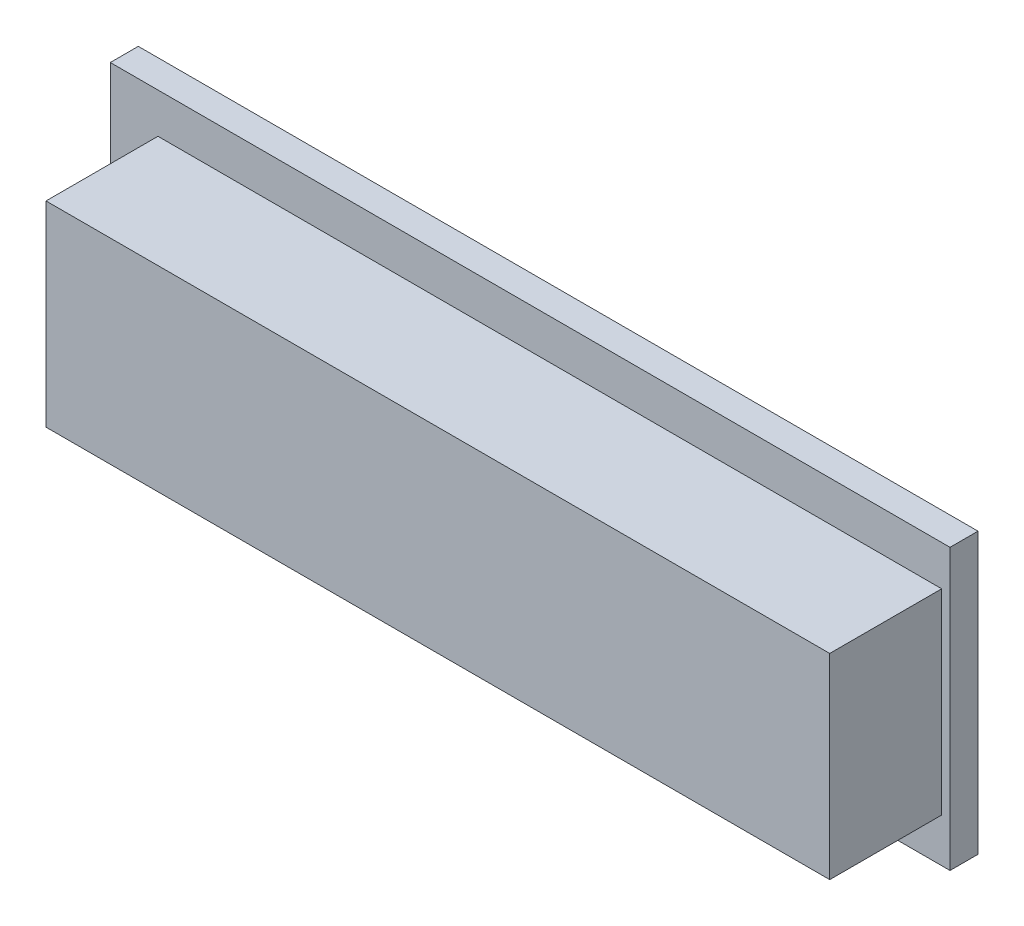
ISO-10303-21;
HEADER;
FILE_DESCRIPTION(('STEP AP214'),'2;1');
FILE_NAME('part.step','',(''),(''),'','','');
FILE_SCHEMA(('AUTOMOTIVE_DESIGN { 1 0 10303 214 1 1 1 1 }'));
ENDSEC;
DATA;
#1=APPLICATION_CONTEXT('core data for automotive mechanical design processes');
#2=APPLICATION_PROTOCOL_DEFINITION('international standard','automotive_design',2000,#1);
#3=PRODUCT_CONTEXT('',#1,'mechanical');
#4=PRODUCT('Part','Part','',(#3));
#5=PRODUCT_RELATED_PRODUCT_CATEGORY('part','',(#4));
#6=PRODUCT_DEFINITION_FORMATION('','',#4);
#7=PRODUCT_DEFINITION_CONTEXT('part definition',#1,'design');
#8=PRODUCT_DEFINITION('design','',#6,#7);
#9=PRODUCT_DEFINITION_SHAPE('','',#8);
#10=(LENGTH_UNIT() NAMED_UNIT(*) SI_UNIT(.MILLI.,.METRE.));
#11=(NAMED_UNIT(*) PLANE_ANGLE_UNIT() SI_UNIT($,.RADIAN.));
#12=(NAMED_UNIT(*) SI_UNIT($,.STERADIAN.) SOLID_ANGLE_UNIT());
#13=UNCERTAINTY_MEASURE_WITH_UNIT(LENGTH_MEASURE(1.E-05),#10,'distance_accuracy_value','');
#14=(GEOMETRIC_REPRESENTATION_CONTEXT(3) GLOBAL_UNCERTAINTY_ASSIGNED_CONTEXT((#13)) GLOBAL_UNIT_ASSIGNED_CONTEXT((#10,
#11,#12)) REPRESENTATION_CONTEXT('',''));
#15=CARTESIAN_POINT('',(0.,0.,0.));
#16=DIRECTION('',(0.,0.,1.));
#17=DIRECTION('',(1.,0.,0.));
#18=AXIS2_PLACEMENT_3D('',#15,#16,#17);
#19=CARTESIAN_POINT('',(-10.0273119940026,-2.22775764766714,5.));
#20=DIRECTION('',(-1.,0.,0.));
#21=DIRECTION('',(0.,0.,1.));
#22=AXIS2_PLACEMENT_3D('',#19,#20,#21);
#23=PLANE('',#22);
#24=DIRECTION('',(0.,1.,0.));
#25=VECTOR('',#24,1.);
#26=CARTESIAN_POINT('',(-10.0273119940026,-12.2277576476671,1.));
#27=LINE('',#26,#25);
#28=CARTESIAN_POINT('',(-10.0273119940026,-12.2277576476671,1.));
#29=VERTEX_POINT('',#28);
#30=CARTESIAN_POINT('',(-10.0273119940026,-2.22775764766714,1.));
#31=VERTEX_POINT('',#30);
#32=EDGE_CURVE('E254',#29,#31,#27,.T.);
#33=ORIENTED_EDGE('',*,*,#32,.F.);
#34=DIRECTION('',(0.,0.,-1.));
#35=VECTOR('',#34,1.);
#36=CARTESIAN_POINT('',(-10.0273119940026,-12.2277576476671,5.));
#37=LINE('',#36,#35);
#38=CARTESIAN_POINT('',(-10.0273119940026,-12.2277576476671,0.));
#39=VERTEX_POINT('',#38);
#40=EDGE_CURVE('E486',#29,#39,#37,.T.);
#41=ORIENTED_EDGE('',*,*,#40,.T.);
#42=DIRECTION('',(0.,1.,0.));
#43=VECTOR('',#42,1.);
#44=CARTESIAN_POINT('',(-10.0273119940026,-2.22775764766714,0.));
#45=LINE('',#44,#43);
#46=CARTESIAN_POINT('',(-10.0273119940026,-2.22775764766714,0.));
#47=VERTEX_POINT('',#46);
#48=EDGE_CURVE('E331',#39,#47,#45,.T.);
#49=ORIENTED_EDGE('',*,*,#48,.T.);
#50=DIRECTION('',(0.,0.,-1.));
#51=VECTOR('',#50,1.);
#52=CARTESIAN_POINT('',(-10.0273119940026,-2.22775764766714,5.));
#53=LINE('',#52,#51);
#54=EDGE_CURVE('E11',#31,#47,#53,.T.);
#55=ORIENTED_EDGE('',*,*,#54,.F.);
#56=EDGE_LOOP('',(#33,#41,#49,#55));
#57=FACE_BOUND('',#56,.T.);
#58=ADVANCED_FACE('F39',(#57),#23,.F.);
#59=CARTESIAN_POINT('',(-40.0273119940026,-2.22775764766714,5.));
#60=DIRECTION('',(0.,-1.,0.));
#61=DIRECTION('',(0.,0.,-1.));
#62=AXIS2_PLACEMENT_3D('',#59,#60,#61);
#63=PLANE('',#62);
#64=DIRECTION('',(-1.,0.,0.));
#65=VECTOR('',#64,1.);
#66=CARTESIAN_POINT('',(-10.0273119940026,-2.22775764766714,1.));
#67=LINE('',#66,#65);
#68=CARTESIAN_POINT('',(-40.0273119940026,-2.22775764766714,1.));
#69=VERTEX_POINT('',#68);
#70=EDGE_CURVE('E257',#31,#69,#67,.T.);
#71=ORIENTED_EDGE('',*,*,#70,.F.);
#72=ORIENTED_EDGE('',*,*,#54,.T.);
#73=DIRECTION('',(-1.,0.,0.));
#74=VECTOR('',#73,1.);
#75=CARTESIAN_POINT('',(-40.0273119940026,-2.22775764766714,0.));
#76=LINE('',#75,#74);
#77=CARTESIAN_POINT('',(-40.0273119940026,-2.22775764766714,0.));
#78=VERTEX_POINT('',#77);
#79=EDGE_CURVE('E474',#47,#78,#76,.T.);
#80=ORIENTED_EDGE('',*,*,#79,.T.);
#81=DIRECTION('',(0.,0.,-1.));
#82=VECTOR('',#81,1.);
#83=CARTESIAN_POINT('',(-40.0273119940026,-2.22775764766714,5.));
#84=LINE('',#83,#82);
#85=EDGE_CURVE('E47',#69,#78,#84,.T.);
#86=ORIENTED_EDGE('',*,*,#85,.F.);
#87=EDGE_LOOP('',(#71,#72,#80,#86));
#88=FACE_BOUND('',#87,.T.);
#89=ADVANCED_FACE('F501',(#88),#63,.F.);
#90=CARTESIAN_POINT('',(-40.0273119940026,-2.22775764766714,5.));
#91=DIRECTION('',(1.,0.,0.));
#92=DIRECTION('',(0.,0.,-1.));
#93=AXIS2_PLACEMENT_3D('',#90,#91,#92);
#94=PLANE('',#93);
#95=DIRECTION('',(0.,-1.,0.));
#96=VECTOR('',#95,1.);
#97=CARTESIAN_POINT('',(-40.0273119940026,-2.22775764766714,1.));
#98=LINE('',#97,#96);
#99=CARTESIAN_POINT('',(-40.0273119940026,-12.2277576476671,1.));
#100=VERTEX_POINT('',#99);
#101=EDGE_CURVE('E54',#69,#100,#98,.T.);
#102=ORIENTED_EDGE('',*,*,#101,.F.);
#103=ORIENTED_EDGE('',*,*,#85,.T.);
#104=DIRECTION('',(0.,-1.,0.));
#105=VECTOR('',#104,1.);
#106=CARTESIAN_POINT('',(-40.0273119940026,-2.22775764766714,0.));
#107=LINE('',#106,#105);
#108=CARTESIAN_POINT('',(-40.0273119940026,-12.2277576476671,0.));
#109=VERTEX_POINT('',#108);
#110=EDGE_CURVE('E478',#78,#109,#107,.T.);
#111=ORIENTED_EDGE('',*,*,#110,.T.);
#112=DIRECTION('',(0.,0.,-1.));
#113=VECTOR('',#112,1.);
#114=CARTESIAN_POINT('',(-40.0273119940026,-12.2277576476671,5.));
#115=LINE('',#114,#113);
#116=EDGE_CURVE('E489',#100,#109,#115,.T.);
#117=ORIENTED_EDGE('',*,*,#116,.F.);
#118=EDGE_LOOP('',(#102,#103,#111,#117));
#119=FACE_BOUND('',#118,.T.);
#120=ADVANCED_FACE('F494',(#119),#94,.F.);
#121=CARTESIAN_POINT('',(-40.0273119940026,-12.2277576476671,5.));
#122=DIRECTION('',(0.,1.,0.));
#123=DIRECTION('',(0.,0.,1.));
#124=AXIS2_PLACEMENT_3D('',#121,#122,#123);
#125=PLANE('',#124);
#126=DIRECTION('',(1.,0.,0.));
#127=VECTOR('',#126,1.);
#128=CARTESIAN_POINT('',(-40.0273119940026,-12.2277576476671,1.));
#129=LINE('',#128,#127);
#130=EDGE_CURVE('E246',#100,#29,#129,.T.);
#131=ORIENTED_EDGE('',*,*,#130,.F.);
#132=ORIENTED_EDGE('',*,*,#116,.T.);
#133=DIRECTION('',(1.,0.,0.));
#134=VECTOR('',#133,1.);
#135=CARTESIAN_POINT('',(-40.0273119940026,-12.2277576476671,0.));
#136=LINE('',#135,#134);
#137=EDGE_CURVE('E482',#109,#39,#136,.T.);
#138=ORIENTED_EDGE('',*,*,#137,.T.);
#139=ORIENTED_EDGE('',*,*,#40,.F.);
#140=EDGE_LOOP('',(#131,#132,#138,#139));
#141=FACE_BOUND('',#140,.T.);
#142=ADVANCED_FACE('F508',(#141),#125,.F.);
#143=CARTESIAN_POINT('',(0.,0.,0.));
#144=DIRECTION('',(0.,0.,1.));
#145=DIRECTION('',(1.,0.,0.));
#146=AXIS2_PLACEMENT_3D('',#143,#144,#145);
#147=PLANE('',#146);
#148=DIRECTION('',(1.,0.,0.));
#149=VECTOR('',#148,1.);
#150=CARTESIAN_POINT('',(-11.5889672536248,-4.15956276151688,0.));
#151=LINE('',#150,#149);
#152=CARTESIAN_POINT('',(-17.7889672536248,-4.15956276151688,0.));
#153=VERTEX_POINT('',#152);
#154=CARTESIAN_POINT('',(-11.5889672536248,-4.15956276151688,0.));
#155=VERTEX_POINT('',#154);
#156=EDGE_CURVE('E316',#153,#155,#151,.T.);
#157=ORIENTED_EDGE('',*,*,#156,.F.);
#158=DIRECTION('',(0.,1.,0.));
#159=VECTOR('',#158,1.);
#160=CARTESIAN_POINT('',(-17.7889672536248,-4.15956276151688,0.));
#161=LINE('',#160,#159);
#162=CARTESIAN_POINT('',(-17.7889672536248,-10.1595627615169,0.));
#163=VERTEX_POINT('',#162);
#164=EDGE_CURVE('E313',#163,#153,#161,.T.);
#165=ORIENTED_EDGE('',*,*,#164,.F.);
#166=DIRECTION('',(-1.,0.,0.));
#167=VECTOR('',#166,1.);
#168=CARTESIAN_POINT('',(-11.5889672536248,-10.1595627615169,0.));
#169=LINE('',#168,#167);
#170=CARTESIAN_POINT('',(-11.5889672536248,-10.1595627615169,0.));
#171=VERTEX_POINT('',#170);
#172=EDGE_CURVE('E300',#171,#163,#169,.T.);
#173=ORIENTED_EDGE('',*,*,#172,.F.);
#174=DIRECTION('',(0.,-1.,0.));
#175=VECTOR('',#174,1.);
#176=CARTESIAN_POINT('',(-11.5889672536248,-4.15956276151688,0.));
#177=LINE('',#176,#175);
#178=EDGE_CURVE('E321',#155,#171,#177,.T.);
#179=ORIENTED_EDGE('',*,*,#178,.F.);
#180=EDGE_LOOP('',(#157,#165,#173,#179));
#181=FACE_BOUND('',#180,.T.);
#182=DIRECTION('',(0.,1.,0.));
#183=VECTOR('',#182,1.);
#184=CARTESIAN_POINT('',(-24.5889672536248,-4.15956276151688,0.));
#185=LINE('',#184,#183);
#186=CARTESIAN_POINT('',(-24.5889672536248,-10.1595627615169,0.));
#187=VERTEX_POINT('',#186);
#188=CARTESIAN_POINT('',(-24.5889672536248,-4.15956276151688,0.));
#189=VERTEX_POINT('',#188);
#190=EDGE_CURVE('E362',#187,#189,#185,.T.);
#191=ORIENTED_EDGE('',*,*,#190,.F.);
#192=DIRECTION('',(-1.,0.,0.));
#193=VECTOR('',#192,1.);
#194=CARTESIAN_POINT('',(-18.3889672536248,-10.1595627615169,0.));
#195=LINE('',#194,#193);
#196=CARTESIAN_POINT('',(-18.3889672536248,-10.1595627615169,0.));
#197=VERTEX_POINT('',#196);
#198=EDGE_CURVE('E359',#197,#187,#195,.T.);
#199=ORIENTED_EDGE('',*,*,#198,.F.);
#200=DIRECTION('',(0.,-1.,0.));
#201=VECTOR('',#200,1.);
#202=CARTESIAN_POINT('',(-18.3889672536248,-4.15956276151688,0.));
#203=LINE('',#202,#201);
#204=CARTESIAN_POINT('',(-18.3889672536248,-4.15956276151688,0.));
#205=VERTEX_POINT('',#204);
#206=EDGE_CURVE('E346',#205,#197,#203,.T.);
#207=ORIENTED_EDGE('',*,*,#206,.F.);
#208=DIRECTION('',(1.,0.,0.));
#209=VECTOR('',#208,1.);
#210=CARTESIAN_POINT('',(-18.3889672536248,-4.15956276151688,0.));
#211=LINE('',#210,#209);
#212=EDGE_CURVE('E367',#189,#205,#211,.T.);
#213=ORIENTED_EDGE('',*,*,#212,.F.);
#214=EDGE_LOOP('',(#191,#199,#207,#213));
#215=FACE_BOUND('',#214,.T.);
#216=DIRECTION('',(0.,1.,0.));
#217=VECTOR('',#216,1.);
#218=CARTESIAN_POINT('',(-31.3889672536248,-4.15956276151688,0.));
#219=LINE('',#218,#217);
#220=CARTESIAN_POINT('',(-31.3889672536248,-10.1595627615169,0.));
#221=VERTEX_POINT('',#220);
#222=CARTESIAN_POINT('',(-31.3889672536248,-4.15956276151688,0.));
#223=VERTEX_POINT('',#222);
#224=EDGE_CURVE('E406',#221,#223,#219,.T.);
#225=ORIENTED_EDGE('',*,*,#224,.F.);
#226=DIRECTION('',(-1.,0.,0.));
#227=VECTOR('',#226,1.);
#228=CARTESIAN_POINT('',(-25.1889672536248,-10.1595627615169,0.));
#229=LINE('',#228,#227);
#230=CARTESIAN_POINT('',(-25.1889672536248,-10.1595627615169,0.));
#231=VERTEX_POINT('',#230);
#232=EDGE_CURVE('E403',#231,#221,#229,.T.);
#233=ORIENTED_EDGE('',*,*,#232,.F.);
#234=DIRECTION('',(0.,-1.,0.));
#235=VECTOR('',#234,1.);
#236=CARTESIAN_POINT('',(-25.1889672536248,-4.15956276151688,0.));
#237=LINE('',#236,#235);
#238=CARTESIAN_POINT('',(-25.1889672536248,-4.15956276151688,0.));
#239=VERTEX_POINT('',#238);
#240=EDGE_CURVE('E390',#239,#231,#237,.T.);
#241=ORIENTED_EDGE('',*,*,#240,.F.);
#242=DIRECTION('',(1.,0.,0.));
#243=VECTOR('',#242,1.);
#244=CARTESIAN_POINT('',(-25.1889672536248,-4.15956276151688,0.));
#245=LINE('',#244,#243);
#246=EDGE_CURVE('E411',#223,#239,#245,.T.);
#247=ORIENTED_EDGE('',*,*,#246,.F.);
#248=EDGE_LOOP('',(#225,#233,#241,#247));
#249=FACE_BOUND('',#248,.T.);
#250=DIRECTION('',(0.,1.,0.));
#251=VECTOR('',#250,1.);
#252=CARTESIAN_POINT('',(-38.1889672536248,-4.15956276151688,0.));
#253=LINE('',#252,#251);
#254=CARTESIAN_POINT('',(-38.1889672536248,-10.1595627615169,0.));
#255=VERTEX_POINT('',#254);
#256=CARTESIAN_POINT('',(-38.1889672536248,-4.15956276151688,0.));
#257=VERTEX_POINT('',#256);
#258=EDGE_CURVE('E449',#255,#257,#253,.T.);
#259=ORIENTED_EDGE('',*,*,#258,.F.);
#260=DIRECTION('',(-1.,0.,0.));
#261=VECTOR('',#260,1.);
#262=CARTESIAN_POINT('',(-31.9889672536248,-10.1595627615169,0.));
#263=LINE('',#262,#261);
#264=CARTESIAN_POINT('',(-31.9889672536248,-10.1595627615169,0.));
#265=VERTEX_POINT('',#264);
#266=EDGE_CURVE('E267',#265,#255,#263,.T.);
#267=ORIENTED_EDGE('',*,*,#266,.F.);
#268=DIRECTION('',(0.,-1.,0.));
#269=VECTOR('',#268,1.);
#270=CARTESIAN_POINT('',(-31.9889672536248,-4.15956276151688,0.));
#271=LINE('',#270,#269);
#272=CARTESIAN_POINT('',(-31.9889672536248,-4.15956276151688,0.));
#273=VERTEX_POINT('',#272);
#274=EDGE_CURVE('E434',#273,#265,#271,.T.);
#275=ORIENTED_EDGE('',*,*,#274,.F.);
#276=DIRECTION('',(1.,0.,0.));
#277=VECTOR('',#276,1.);
#278=CARTESIAN_POINT('',(-31.9889672536248,-4.15956276151688,0.));
#279=LINE('',#278,#277);
#280=EDGE_CURVE('E453',#257,#273,#279,.T.);
#281=ORIENTED_EDGE('',*,*,#280,.F.);
#282=EDGE_LOOP('',(#259,#267,#275,#281));
#283=FACE_BOUND('',#282,.T.);
#284=ORIENTED_EDGE('',*,*,#48,.F.);
#285=ORIENTED_EDGE('',*,*,#137,.F.);
#286=ORIENTED_EDGE('',*,*,#110,.F.);
#287=ORIENTED_EDGE('',*,*,#79,.F.);
#288=EDGE_LOOP('',(#284,#285,#286,#287));
#289=FACE_BOUND('',#288,.T.);
#290=ADVANCED_FACE('F505',(#181,#215,#249,#283,#289),#147,.F.);
#291=CARTESIAN_POINT('',(-31.9889672536248,-10.1595627615169,2.));
#292=DIRECTION('',(0.,-1.,0.));
#293=DIRECTION('',(0.,0.,-1.));
#294=AXIS2_PLACEMENT_3D('',#291,#292,#293);
#295=PLANE('',#294);
#296=ORIENTED_EDGE('',*,*,#266,.T.);
#297=DIRECTION('',(0.,0.,-1.));
#298=VECTOR('',#297,1.);
#299=CARTESIAN_POINT('',(-38.1889672536248,-10.1595627615169,2.));
#300=LINE('',#299,#298);
#301=CARTESIAN_POINT('',(-38.1889672536248,-10.1595627615169,2.));
#302=VERTEX_POINT('',#301);
#303=EDGE_CURVE('E446',#302,#255,#300,.T.);
#304=ORIENTED_EDGE('',*,*,#303,.F.);
#305=DIRECTION('',(-1.,0.,0.));
#306=VECTOR('',#305,1.);
#307=CARTESIAN_POINT('',(-31.9889672536248,-10.1595627615169,2.));
#308=LINE('',#307,#306);
#309=CARTESIAN_POINT('',(-31.9889672536248,-10.1595627615169,2.));
#310=VERTEX_POINT('',#309);
#311=EDGE_CURVE('E429',#310,#302,#308,.T.);
#312=ORIENTED_EDGE('',*,*,#311,.F.);
#313=DIRECTION('',(0.,0.,-1.));
#314=VECTOR('',#313,1.);
#315=CARTESIAN_POINT('',(-31.9889672536248,-10.1595627615169,2.));
#316=LINE('',#315,#314);
#317=EDGE_CURVE('E407',#310,#265,#316,.T.);
#318=ORIENTED_EDGE('',*,*,#317,.T.);
#319=EDGE_LOOP('',(#296,#304,#312,#318));
#320=FACE_BOUND('',#319,.T.);
#321=ADVANCED_FACE('F524',(#320),#295,.F.);
#322=CARTESIAN_POINT('',(-31.9889672536248,-4.15956276151688,2.));
#323=DIRECTION('',(1.,0.,0.));
#324=DIRECTION('',(0.,0.,-1.));
#325=AXIS2_PLACEMENT_3D('',#322,#323,#324);
#326=PLANE('',#325);
#327=ORIENTED_EDGE('',*,*,#274,.T.);
#328=ORIENTED_EDGE('',*,*,#317,.F.);
#329=DIRECTION('',(0.,-1.,0.));
#330=VECTOR('',#329,1.);
#331=CARTESIAN_POINT('',(-31.9889672536248,-4.15956276151688,2.));
#332=LINE('',#331,#330);
#333=CARTESIAN_POINT('',(-31.9889672536248,-4.15956276151688,2.));
#334=VERTEX_POINT('',#333);
#335=EDGE_CURVE('E442',#334,#310,#332,.T.);
#336=ORIENTED_EDGE('',*,*,#335,.F.);
#337=DIRECTION('',(0.,0.,-1.));
#338=VECTOR('',#337,1.);
#339=CARTESIAN_POINT('',(-31.9889672536248,-4.15956276151688,2.));
#340=LINE('',#339,#338);
#341=EDGE_CURVE('E462',#334,#273,#340,.T.);
#342=ORIENTED_EDGE('',*,*,#341,.T.);
#343=EDGE_LOOP('',(#327,#328,#336,#342));
#344=FACE_BOUND('',#343,.T.);
#345=ADVANCED_FACE('F532',(#344),#326,.F.);
#346=CARTESIAN_POINT('',(-31.9889672536248,-4.15956276151688,2.));
#347=DIRECTION('',(0.,1.,0.));
#348=DIRECTION('',(0.,0.,1.));
#349=AXIS2_PLACEMENT_3D('',#346,#347,#348);
#350=PLANE('',#349);
#351=ORIENTED_EDGE('',*,*,#280,.T.);
#352=ORIENTED_EDGE('',*,*,#341,.F.);
#353=DIRECTION('',(1.,0.,0.));
#354=VECTOR('',#353,1.);
#355=CARTESIAN_POINT('',(-31.9889672536248,-4.15956276151688,2.));
#356=LINE('',#355,#354);
#357=CARTESIAN_POINT('',(-38.1889672536248,-4.15956276151688,2.));
#358=VERTEX_POINT('',#357);
#359=EDGE_CURVE('E438',#358,#334,#356,.T.);
#360=ORIENTED_EDGE('',*,*,#359,.F.);
#361=DIRECTION('',(0.,0.,-1.));
#362=VECTOR('',#361,1.);
#363=CARTESIAN_POINT('',(-38.1889672536248,-4.15956276151688,2.));
#364=LINE('',#363,#362);
#365=EDGE_CURVE('E465',#358,#257,#364,.T.);
#366=ORIENTED_EDGE('',*,*,#365,.T.);
#367=EDGE_LOOP('',(#351,#352,#360,#366));
#368=FACE_BOUND('',#367,.T.);
#369=ADVANCED_FACE('F538',(#368),#350,.F.);
#370=CARTESIAN_POINT('',(-38.1889672536248,-4.15956276151688,2.));
#371=DIRECTION('',(-1.,0.,0.));
#372=DIRECTION('',(0.,0.,1.));
#373=AXIS2_PLACEMENT_3D('',#370,#371,#372);
#374=PLANE('',#373);
#375=ORIENTED_EDGE('',*,*,#258,.T.);
#376=ORIENTED_EDGE('',*,*,#365,.F.);
#377=DIRECTION('',(0.,1.,0.));
#378=VECTOR('',#377,1.);
#379=CARTESIAN_POINT('',(-38.1889672536248,-4.15956276151688,2.));
#380=LINE('',#379,#378);
#381=EDGE_CURVE('E433',#302,#358,#380,.T.);
#382=ORIENTED_EDGE('',*,*,#381,.F.);
#383=ORIENTED_EDGE('',*,*,#303,.T.);
#384=EDGE_LOOP('',(#375,#376,#382,#383));
#385=FACE_BOUND('',#384,.T.);
#386=ADVANCED_FACE('F534',(#385),#374,.F.);
#387=CARTESIAN_POINT('',(0.,0.,2.));
#388=DIRECTION('',(0.,0.,1.));
#389=DIRECTION('',(1.,0.,0.));
#390=AXIS2_PLACEMENT_3D('',#387,#388,#389);
#391=PLANE('',#390);
#392=CARTESIAN_POINT('',(-35.0889672536248,-7.15956276151688,2.));
#393=DIRECTION('',(0.,0.,-1.));
#394=DIRECTION('',(-1.,0.,0.));
#395=AXIS2_PLACEMENT_3D('',#392,#393,#394);
#396=CIRCLE('',#395,1.5);
#397=CARTESIAN_POINT('',(-36.5889672536248,-7.15956276151688,2.));
#398=VERTEX_POINT('',#397);
#399=EDGE_CURVE('E262',#398,#398,#396,.T.);
#400=ORIENTED_EDGE('',*,*,#399,.F.);
#401=EDGE_LOOP('',(#400));
#402=FACE_BOUND('',#401,.T.);
#403=ORIENTED_EDGE('',*,*,#311,.T.);
#404=ORIENTED_EDGE('',*,*,#381,.T.);
#405=ORIENTED_EDGE('',*,*,#359,.T.);
#406=ORIENTED_EDGE('',*,*,#335,.T.);
#407=EDGE_LOOP('',(#403,#404,#405,#406));
#408=FACE_BOUND('',#407,.T.);
#409=ADVANCED_FACE('F537',(#402,#408),#391,.F.);
#410=CARTESIAN_POINT('',(-25.1889672536248,-10.1595627615169,2.));
#411=DIRECTION('',(0.,-1.,0.));
#412=DIRECTION('',(0.,0.,-1.));
#413=AXIS2_PLACEMENT_3D('',#410,#411,#412);
#414=PLANE('',#413);
#415=ORIENTED_EDGE('',*,*,#232,.T.);
#416=DIRECTION('',(0.,0.,-1.));
#417=VECTOR('',#416,1.);
#418=CARTESIAN_POINT('',(-31.3889672536248,-10.1595627615169,2.));
#419=LINE('',#418,#417);
#420=CARTESIAN_POINT('',(-31.3889672536248,-10.1595627615169,2.));
#421=VERTEX_POINT('',#420);
#422=EDGE_CURVE('E402',#421,#221,#419,.T.);
#423=ORIENTED_EDGE('',*,*,#422,.F.);
#424=DIRECTION('',(-1.,0.,0.));
#425=VECTOR('',#424,1.);
#426=CARTESIAN_POINT('',(-25.1889672536248,-10.1595627615169,2.));
#427=LINE('',#426,#425);
#428=CARTESIAN_POINT('',(-25.1889672536248,-10.1595627615169,2.));
#429=VERTEX_POINT('',#428);
#430=EDGE_CURVE('E385',#429,#421,#427,.T.);
#431=ORIENTED_EDGE('',*,*,#430,.F.);
#432=DIRECTION('',(0.,0.,-1.));
#433=VECTOR('',#432,1.);
#434=CARTESIAN_POINT('',(-25.1889672536248,-10.1595627615169,2.));
#435=LINE('',#434,#433);
#436=EDGE_CURVE('E363',#429,#231,#435,.T.);
#437=ORIENTED_EDGE('',*,*,#436,.T.);
#438=EDGE_LOOP('',(#415,#423,#431,#437));
#439=FACE_BOUND('',#438,.T.);
#440=ADVANCED_FACE('F548',(#439),#414,.F.);
#441=CARTESIAN_POINT('',(-25.1889672536248,-4.15956276151688,2.));
#442=DIRECTION('',(1.,0.,0.));
#443=DIRECTION('',(0.,1.,0.));
#444=AXIS2_PLACEMENT_3D('',#441,#442,#443);
#445=PLANE('',#444);
#446=ORIENTED_EDGE('',*,*,#240,.T.);
#447=ORIENTED_EDGE('',*,*,#436,.F.);
#448=DIRECTION('',(0.,-1.,0.));
#449=VECTOR('',#448,1.);
#450=CARTESIAN_POINT('',(-25.1889672536248,-4.15956276151688,2.));
#451=LINE('',#450,#449);
#452=CARTESIAN_POINT('',(-25.1889672536248,-4.15956276151688,2.));
#453=VERTEX_POINT('',#452);
#454=EDGE_CURVE('E398',#453,#429,#451,.T.);
#455=ORIENTED_EDGE('',*,*,#454,.F.);
#456=DIRECTION('',(0.,0.,-1.));
#457=VECTOR('',#456,1.);
#458=CARTESIAN_POINT('',(-25.1889672536248,-4.15956276151688,2.));
#459=LINE('',#458,#457);
#460=EDGE_CURVE('E420',#453,#239,#459,.T.);
#461=ORIENTED_EDGE('',*,*,#460,.T.);
#462=EDGE_LOOP('',(#446,#447,#455,#461));
#463=FACE_BOUND('',#462,.T.);
#464=ADVANCED_FACE('F552',(#463),#445,.F.);
#465=CARTESIAN_POINT('',(-25.1889672536248,-4.15956276151688,2.));
#466=DIRECTION('',(0.,1.,0.));
#467=DIRECTION('',(0.,0.,1.));
#468=AXIS2_PLACEMENT_3D('',#465,#466,#467);
#469=PLANE('',#468);
#470=ORIENTED_EDGE('',*,*,#246,.T.);
#471=ORIENTED_EDGE('',*,*,#460,.F.);
#472=DIRECTION('',(1.,0.,0.));
#473=VECTOR('',#472,1.);
#474=CARTESIAN_POINT('',(-25.1889672536248,-4.15956276151688,2.));
#475=LINE('',#474,#473);
#476=CARTESIAN_POINT('',(-31.3889672536248,-4.15956276151688,2.));
#477=VERTEX_POINT('',#476);
#478=EDGE_CURVE('E394',#477,#453,#475,.T.);
#479=ORIENTED_EDGE('',*,*,#478,.F.);
#480=DIRECTION('',(0.,0.,-1.));
#481=VECTOR('',#480,1.);
#482=CARTESIAN_POINT('',(-31.3889672536248,-4.15956276151688,2.));
#483=LINE('',#482,#481);
#484=EDGE_CURVE('E423',#477,#223,#483,.T.);
#485=ORIENTED_EDGE('',*,*,#484,.T.);
#486=EDGE_LOOP('',(#470,#471,#479,#485));
#487=FACE_BOUND('',#486,.T.);
#488=ADVANCED_FACE('F558',(#487),#469,.F.);
#489=CARTESIAN_POINT('',(-31.3889672536248,-4.15956276151688,2.));
#490=DIRECTION('',(-1.,0.,0.));
#491=DIRECTION('',(0.,0.,1.));
#492=AXIS2_PLACEMENT_3D('',#489,#490,#491);
#493=PLANE('',#492);
#494=ORIENTED_EDGE('',*,*,#224,.T.);
#495=ORIENTED_EDGE('',*,*,#484,.F.);
#496=DIRECTION('',(0.,1.,0.));
#497=VECTOR('',#496,1.);
#498=CARTESIAN_POINT('',(-31.3889672536248,-4.15956276151688,2.));
#499=LINE('',#498,#497);
#500=EDGE_CURVE('E389',#421,#477,#499,.T.);
#501=ORIENTED_EDGE('',*,*,#500,.F.);
#502=ORIENTED_EDGE('',*,*,#422,.T.);
#503=EDGE_LOOP('',(#494,#495,#501,#502));
#504=FACE_BOUND('',#503,.T.);
#505=ADVANCED_FACE('F554',(#504),#493,.F.);
#506=CARTESIAN_POINT('',(0.,0.,2.));
#507=DIRECTION('',(0.,0.,1.));
#508=DIRECTION('',(1.,0.,0.));
#509=AXIS2_PLACEMENT_3D('',#506,#507,#508);
#510=PLANE('',#509);
#511=CARTESIAN_POINT('',(-28.2889672536248,-7.15956276151688,2.));
#512=DIRECTION('',(0.,0.,-1.));
#513=DIRECTION('',(-1.,0.,0.));
#514=AXIS2_PLACEMENT_3D('',#511,#512,#513);
#515=CIRCLE('',#514,1.5);
#516=CARTESIAN_POINT('',(-29.7889672536248,-7.15956276151688,2.));
#517=VERTEX_POINT('',#516);
#518=EDGE_CURVE('E284',#517,#517,#515,.T.);
#519=ORIENTED_EDGE('',*,*,#518,.F.);
#520=EDGE_LOOP('',(#519));
#521=FACE_BOUND('',#520,.T.);
#522=ORIENTED_EDGE('',*,*,#430,.T.);
#523=ORIENTED_EDGE('',*,*,#500,.T.);
#524=ORIENTED_EDGE('',*,*,#478,.T.);
#525=ORIENTED_EDGE('',*,*,#454,.T.);
#526=EDGE_LOOP('',(#522,#523,#524,#525));
#527=FACE_BOUND('',#526,.T.);
#528=ADVANCED_FACE('F557',(#521,#527),#510,.F.);
#529=CARTESIAN_POINT('',(-18.3889672536248,-10.1595627615169,2.));
#530=DIRECTION('',(0.,-1.,0.));
#531=DIRECTION('',(0.,0.,-1.));
#532=AXIS2_PLACEMENT_3D('',#529,#530,#531);
#533=PLANE('',#532);
#534=ORIENTED_EDGE('',*,*,#198,.T.);
#535=DIRECTION('',(0.,0.,-1.));
#536=VECTOR('',#535,1.);
#537=CARTESIAN_POINT('',(-24.5889672536248,-10.1595627615169,2.));
#538=LINE('',#537,#536);
#539=CARTESIAN_POINT('',(-24.5889672536248,-10.1595627615169,2.));
#540=VERTEX_POINT('',#539);
#541=EDGE_CURVE('E358',#540,#187,#538,.T.);
#542=ORIENTED_EDGE('',*,*,#541,.F.);
#543=DIRECTION('',(-1.,0.,0.));
#544=VECTOR('',#543,1.);
#545=CARTESIAN_POINT('',(-18.3889672536248,-10.1595627615169,2.));
#546=LINE('',#545,#544);
#547=CARTESIAN_POINT('',(-18.3889672536248,-10.1595627615169,2.));
#548=VERTEX_POINT('',#547);
#549=EDGE_CURVE('E341',#548,#540,#546,.T.);
#550=ORIENTED_EDGE('',*,*,#549,.F.);
#551=DIRECTION('',(0.,0.,-1.));
#552=VECTOR('',#551,1.);
#553=CARTESIAN_POINT('',(-18.3889672536248,-10.1595627615169,2.));
#554=LINE('',#553,#552);
#555=EDGE_CURVE('E317',#548,#197,#554,.T.);
#556=ORIENTED_EDGE('',*,*,#555,.T.);
#557=EDGE_LOOP('',(#534,#542,#550,#556));
#558=FACE_BOUND('',#557,.T.);
#559=ADVANCED_FACE('F568',(#558),#533,.F.);
#560=CARTESIAN_POINT('',(-18.3889672536248,-4.15956276151688,2.));
#561=DIRECTION('',(1.,0.,0.));
#562=DIRECTION('',(0.,0.,-1.));
#563=AXIS2_PLACEMENT_3D('',#560,#561,#562);
#564=PLANE('',#563);
#565=ORIENTED_EDGE('',*,*,#206,.T.);
#566=ORIENTED_EDGE('',*,*,#555,.F.);
#567=DIRECTION('',(0.,-1.,0.));
#568=VECTOR('',#567,1.);
#569=CARTESIAN_POINT('',(-18.3889672536248,-4.15956276151688,2.));
#570=LINE('',#569,#568);
#571=CARTESIAN_POINT('',(-18.3889672536248,-4.15956276151688,2.));
#572=VERTEX_POINT('',#571);
#573=EDGE_CURVE('E354',#572,#548,#570,.T.);
#574=ORIENTED_EDGE('',*,*,#573,.F.);
#575=DIRECTION('',(0.,0.,-1.));
#576=VECTOR('',#575,1.);
#577=CARTESIAN_POINT('',(-18.3889672536248,-4.15956276151688,2.));
#578=LINE('',#577,#576);
#579=EDGE_CURVE('E376',#572,#205,#578,.T.);
#580=ORIENTED_EDGE('',*,*,#579,.T.);
#581=EDGE_LOOP('',(#565,#566,#574,#580));
#582=FACE_BOUND('',#581,.T.);
#583=ADVANCED_FACE('F572',(#582),#564,.F.);
#584=CARTESIAN_POINT('',(-18.3889672536248,-4.15956276151688,2.));
#585=DIRECTION('',(0.,1.,0.));
#586=DIRECTION('',(0.,0.,1.));
#587=AXIS2_PLACEMENT_3D('',#584,#585,#586);
#588=PLANE('',#587);
#589=ORIENTED_EDGE('',*,*,#212,.T.);
#590=ORIENTED_EDGE('',*,*,#579,.F.);
#591=DIRECTION('',(1.,0.,0.));
#592=VECTOR('',#591,1.);
#593=CARTESIAN_POINT('',(-18.3889672536248,-4.15956276151688,2.));
#594=LINE('',#593,#592);
#595=CARTESIAN_POINT('',(-24.5889672536248,-4.15956276151688,2.));
#596=VERTEX_POINT('',#595);
#597=EDGE_CURVE('E350',#596,#572,#594,.T.);
#598=ORIENTED_EDGE('',*,*,#597,.F.);
#599=DIRECTION('',(0.,0.,-1.));
#600=VECTOR('',#599,1.);
#601=CARTESIAN_POINT('',(-24.5889672536248,-4.15956276151688,2.));
#602=LINE('',#601,#600);
#603=EDGE_CURVE('E379',#596,#189,#602,.T.);
#604=ORIENTED_EDGE('',*,*,#603,.T.);
#605=EDGE_LOOP('',(#589,#590,#598,#604));
#606=FACE_BOUND('',#605,.T.);
#607=ADVANCED_FACE('F578',(#606),#588,.F.);
#608=CARTESIAN_POINT('',(-24.5889672536248,-4.15956276151688,2.));
#609=DIRECTION('',(-1.,0.,0.));
#610=DIRECTION('',(0.,0.,1.));
#611=AXIS2_PLACEMENT_3D('',#608,#609,#610);
#612=PLANE('',#611);
#613=ORIENTED_EDGE('',*,*,#190,.T.);
#614=ORIENTED_EDGE('',*,*,#603,.F.);
#615=DIRECTION('',(0.,1.,0.));
#616=VECTOR('',#615,1.);
#617=CARTESIAN_POINT('',(-24.5889672536248,-4.15956276151688,2.));
#618=LINE('',#617,#616);
#619=EDGE_CURVE('E345',#540,#596,#618,.T.);
#620=ORIENTED_EDGE('',*,*,#619,.F.);
#621=ORIENTED_EDGE('',*,*,#541,.T.);
#622=EDGE_LOOP('',(#613,#614,#620,#621));
#623=FACE_BOUND('',#622,.T.);
#624=ADVANCED_FACE('F574',(#623),#612,.F.);
#625=CARTESIAN_POINT('',(0.,0.,2.));
#626=DIRECTION('',(0.,0.,1.));
#627=DIRECTION('',(1.,0.,0.));
#628=AXIS2_PLACEMENT_3D('',#625,#626,#627);
#629=PLANE('',#628);
#630=CARTESIAN_POINT('',(-21.4889672536248,-7.15956276151688,2.));
#631=DIRECTION('',(0.,0.,-1.));
#632=DIRECTION('',(-1.,0.,0.));
#633=AXIS2_PLACEMENT_3D('',#630,#631,#632);
#634=CIRCLE('',#633,1.5);
#635=CARTESIAN_POINT('',(-22.9889672536248,-7.15956276151688,2.));
#636=VERTEX_POINT('',#635);
#637=EDGE_CURVE('E276',#636,#636,#634,.T.);
#638=ORIENTED_EDGE('',*,*,#637,.F.);
#639=EDGE_LOOP('',(#638));
#640=FACE_BOUND('',#639,.T.);
#641=ORIENTED_EDGE('',*,*,#549,.T.);
#642=ORIENTED_EDGE('',*,*,#619,.T.);
#643=ORIENTED_EDGE('',*,*,#597,.T.);
#644=ORIENTED_EDGE('',*,*,#573,.T.);
#645=EDGE_LOOP('',(#641,#642,#643,#644));
#646=FACE_BOUND('',#645,.T.);
#647=ADVANCED_FACE('F577',(#640,#646),#629,.F.);
#648=CARTESIAN_POINT('',(-17.7889672536248,-4.15956276151688,2.));
#649=DIRECTION('',(-1.,0.,0.));
#650=DIRECTION('',(0.,0.,1.));
#651=AXIS2_PLACEMENT_3D('',#648,#649,#650);
#652=PLANE('',#651);
#653=ORIENTED_EDGE('',*,*,#164,.T.);
#654=DIRECTION('',(0.,0.,-1.));
#655=VECTOR('',#654,1.);
#656=CARTESIAN_POINT('',(-17.7889672536248,-4.15956276151688,2.));
#657=LINE('',#656,#655);
#658=CARTESIAN_POINT('',(-17.7889672536248,-4.15956276151688,2.));
#659=VERTEX_POINT('',#658);
#660=EDGE_CURVE('E312',#659,#153,#657,.T.);
#661=ORIENTED_EDGE('',*,*,#660,.F.);
#662=DIRECTION('',(0.,1.,0.));
#663=VECTOR('',#662,1.);
#664=CARTESIAN_POINT('',(-17.7889672536248,-4.15956276151688,2.));
#665=LINE('',#664,#663);
#666=CARTESIAN_POINT('',(-17.7889672536248,-10.1595627615169,2.));
#667=VERTEX_POINT('',#666);
#668=EDGE_CURVE('E295',#667,#659,#665,.T.);
#669=ORIENTED_EDGE('',*,*,#668,.F.);
#670=DIRECTION('',(0.,0.,-1.));
#671=VECTOR('',#670,1.);
#672=CARTESIAN_POINT('',(-17.7889672536248,-10.1595627615169,2.));
#673=LINE('',#672,#671);
#674=EDGE_CURVE('E328',#667,#163,#673,.T.);
#675=ORIENTED_EDGE('',*,*,#674,.T.);
#676=EDGE_LOOP('',(#653,#661,#669,#675));
#677=FACE_BOUND('',#676,.T.);
#678=ADVANCED_FACE('F588',(#677),#652,.F.);
#679=CARTESIAN_POINT('',(-11.5889672536248,-10.1595627615169,2.));
#680=DIRECTION('',(0.,-1.,0.));
#681=DIRECTION('',(0.,0.,-1.));
#682=AXIS2_PLACEMENT_3D('',#679,#680,#681);
#683=PLANE('',#682);
#684=ORIENTED_EDGE('',*,*,#172,.T.);
#685=ORIENTED_EDGE('',*,*,#674,.F.);
#686=DIRECTION('',(-1.,0.,0.));
#687=VECTOR('',#686,1.);
#688=CARTESIAN_POINT('',(-11.5889672536248,-10.1595627615169,2.));
#689=LINE('',#688,#687);
#690=CARTESIAN_POINT('',(-11.5889672536248,-10.1595627615169,2.));
#691=VERTEX_POINT('',#690);
#692=EDGE_CURVE('E308',#691,#667,#689,.T.);
#693=ORIENTED_EDGE('',*,*,#692,.F.);
#694=DIRECTION('',(0.,0.,-1.));
#695=VECTOR('',#694,1.);
#696=CARTESIAN_POINT('',(-11.5889672536248,-10.1595627615169,2.));
#697=LINE('',#696,#695);
#698=EDGE_CURVE('E332',#691,#171,#697,.T.);
#699=ORIENTED_EDGE('',*,*,#698,.T.);
#700=EDGE_LOOP('',(#684,#685,#693,#699));
#701=FACE_BOUND('',#700,.T.);
#702=ADVANCED_FACE('F592',(#701),#683,.F.);
#703=CARTESIAN_POINT('',(-11.5889672536248,-4.15956276151688,2.));
#704=DIRECTION('',(1.,0.,0.));
#705=DIRECTION('',(0.,1.,0.));
#706=AXIS2_PLACEMENT_3D('',#703,#704,#705);
#707=PLANE('',#706);
#708=ORIENTED_EDGE('',*,*,#178,.T.);
#709=ORIENTED_EDGE('',*,*,#698,.F.);
#710=DIRECTION('',(0.,-1.,0.));
#711=VECTOR('',#710,1.);
#712=CARTESIAN_POINT('',(-11.5889672536248,-4.15956276151688,2.));
#713=LINE('',#712,#711);
#714=CARTESIAN_POINT('',(-11.5889672536248,-4.15956276151688,2.));
#715=VERTEX_POINT('',#714);
#716=EDGE_CURVE('E304',#715,#691,#713,.T.);
#717=ORIENTED_EDGE('',*,*,#716,.F.);
#718=DIRECTION('',(0.,0.,-1.));
#719=VECTOR('',#718,1.);
#720=CARTESIAN_POINT('',(-11.5889672536248,-4.15956276151688,2.));
#721=LINE('',#720,#719);
#722=EDGE_CURVE('E335',#715,#155,#721,.T.);
#723=ORIENTED_EDGE('',*,*,#722,.T.);
#724=EDGE_LOOP('',(#708,#709,#717,#723));
#725=FACE_BOUND('',#724,.T.);
#726=ADVANCED_FACE('F598',(#725),#707,.F.);
#727=CARTESIAN_POINT('',(-11.5889672536248,-4.15956276151688,2.));
#728=DIRECTION('',(0.,1.,0.));
#729=DIRECTION('',(0.,0.,1.));
#730=AXIS2_PLACEMENT_3D('',#727,#728,#729);
#731=PLANE('',#730);
#732=ORIENTED_EDGE('',*,*,#156,.T.);
#733=ORIENTED_EDGE('',*,*,#722,.F.);
#734=DIRECTION('',(1.,0.,0.));
#735=VECTOR('',#734,1.);
#736=CARTESIAN_POINT('',(-11.5889672536248,-4.15956276151688,2.));
#737=LINE('',#736,#735);
#738=EDGE_CURVE('E299',#659,#715,#737,.T.);
#739=ORIENTED_EDGE('',*,*,#738,.F.);
#740=ORIENTED_EDGE('',*,*,#660,.T.);
#741=EDGE_LOOP('',(#732,#733,#739,#740));
#742=FACE_BOUND('',#741,.T.);
#743=ADVANCED_FACE('F594',(#742),#731,.F.);
#744=CARTESIAN_POINT('',(0.,0.,2.));
#745=DIRECTION('',(0.,0.,-1.));
#746=DIRECTION('',(-1.,0.,0.));
#747=AXIS2_PLACEMENT_3D('',#744,#745,#746);
#748=PLANE('',#747);
#749=CARTESIAN_POINT('',(-14.6889672536248,-7.15956276151688,2.));
#750=DIRECTION('',(0.,0.,-1.));
#751=DIRECTION('',(-1.,0.,0.));
#752=AXIS2_PLACEMENT_3D('',#749,#750,#751);
#753=CIRCLE('',#752,1.5);
#754=CARTESIAN_POINT('',(-16.1889672536248,-7.15956276151688,2.));
#755=VERTEX_POINT('',#754);
#756=EDGE_CURVE('E268',#755,#755,#753,.T.);
#757=ORIENTED_EDGE('',*,*,#756,.F.);
#758=EDGE_LOOP('',(#757));
#759=FACE_BOUND('',#758,.T.);
#760=ORIENTED_EDGE('',*,*,#668,.T.);
#761=ORIENTED_EDGE('',*,*,#738,.T.);
#762=ORIENTED_EDGE('',*,*,#716,.T.);
#763=ORIENTED_EDGE('',*,*,#692,.T.);
#764=EDGE_LOOP('',(#760,#761,#762,#763));
#765=FACE_BOUND('',#764,.T.);
#766=ADVANCED_FACE('F597',(#759,#765),#748,.T.);
#767=CARTESIAN_POINT('',(-14.6889672536248,-7.15956276151688,4.));
#768=DIRECTION('',(0.,0.,-1.));
#769=DIRECTION('',(-1.,0.,0.));
#770=AXIS2_PLACEMENT_3D('',#767,#768,#769);
#771=CYLINDRICAL_SURFACE('',#770,1.5);
#772=CARTESIAN_POINT('',(-14.6889672536248,-7.15956276151688,4.));
#773=DIRECTION('',(0.,0.,-1.));
#774=DIRECTION('',(-1.,0.,0.));
#775=AXIS2_PLACEMENT_3D('',#772,#773,#774);
#776=CIRCLE('',#775,1.5);
#777=CARTESIAN_POINT('',(-16.1889672536248,-7.15956276151688,4.));
#778=VERTEX_POINT('',#777);
#779=EDGE_CURVE('E263',#778,#778,#776,.T.);
#780=ORIENTED_EDGE('',*,*,#779,.F.);
#781=EDGE_LOOP('',(#780));
#782=FACE_BOUND('',#781,.T.);
#783=ORIENTED_EDGE('',*,*,#756,.T.);
#784=EDGE_LOOP('',(#783));
#785=FACE_BOUND('',#784,.T.);
#786=ADVANCED_FACE('F608',(#782,#785),#771,.F.);
#787=CARTESIAN_POINT('',(-14.6889672536248,-7.15956276151688,4.));
#788=DIRECTION('',(0.,0.,-1.));
#789=DIRECTION('',(-1.,0.,0.));
#790=AXIS2_PLACEMENT_3D('',#787,#788,#789);
#791=PLANE('',#790);
#792=ORIENTED_EDGE('',*,*,#779,.T.);
#793=EDGE_LOOP('',(#792));
#794=FACE_BOUND('',#793,.T.);
#795=ADVANCED_FACE('F630',(#794),#791,.T.);
#796=CARTESIAN_POINT('',(-21.4889672536248,-7.15956276151688,4.));
#797=DIRECTION('',(0.,0.,-1.));
#798=DIRECTION('',(-1.,0.,0.));
#799=AXIS2_PLACEMENT_3D('',#796,#797,#798);
#800=CYLINDRICAL_SURFACE('',#799,1.5);
#801=CARTESIAN_POINT('',(-21.4889672536248,-7.15956276151688,4.));
#802=DIRECTION('',(0.,0.,-1.));
#803=DIRECTION('',(-1.,0.,0.));
#804=AXIS2_PLACEMENT_3D('',#801,#802,#803);
#805=CIRCLE('',#804,1.5);
#806=CARTESIAN_POINT('',(-22.9889672536248,-7.15956276151688,4.));
#807=VERTEX_POINT('',#806);
#808=EDGE_CURVE('E272',#807,#807,#805,.T.);
#809=ORIENTED_EDGE('',*,*,#808,.F.);
#810=EDGE_LOOP('',(#809));
#811=FACE_BOUND('',#810,.T.);
#812=ORIENTED_EDGE('',*,*,#637,.T.);
#813=EDGE_LOOP('',(#812));
#814=FACE_BOUND('',#813,.T.);
#815=ADVANCED_FACE('F627',(#811,#814),#800,.F.);
#816=CARTESIAN_POINT('',(-21.4889672536248,-7.15956276151688,4.));
#817=DIRECTION('',(0.,0.,-1.));
#818=DIRECTION('',(-1.,0.,0.));
#819=AXIS2_PLACEMENT_3D('',#816,#817,#818);
#820=PLANE('',#819);
#821=ORIENTED_EDGE('',*,*,#808,.T.);
#822=EDGE_LOOP('',(#821));
#823=FACE_BOUND('',#822,.T.);
#824=ADVANCED_FACE('F622',(#823),#820,.T.);
#825=CARTESIAN_POINT('',(-28.2889672536248,-7.15956276151688,4.));
#826=DIRECTION('',(0.,0.,-1.));
#827=DIRECTION('',(-1.,0.,0.));
#828=AXIS2_PLACEMENT_3D('',#825,#826,#827);
#829=CYLINDRICAL_SURFACE('',#828,1.5);
#830=CARTESIAN_POINT('',(-28.2889672536248,-7.15956276151688,4.));
#831=DIRECTION('',(0.,0.,-1.));
#832=DIRECTION('',(-1.,0.,0.));
#833=AXIS2_PLACEMENT_3D('',#830,#831,#832);
#834=CIRCLE('',#833,1.5);
#835=CARTESIAN_POINT('',(-29.7889672536248,-7.15956276151688,4.));
#836=VERTEX_POINT('',#835);
#837=EDGE_CURVE('E280',#836,#836,#834,.T.);
#838=ORIENTED_EDGE('',*,*,#837,.F.);
#839=EDGE_LOOP('',(#838));
#840=FACE_BOUND('',#839,.T.);
#841=ORIENTED_EDGE('',*,*,#518,.T.);
#842=EDGE_LOOP('',(#841));
#843=FACE_BOUND('',#842,.T.);
#844=ADVANCED_FACE('F619',(#840,#843),#829,.F.);
#845=CARTESIAN_POINT('',(-28.2889672536248,-7.15956276151688,4.));
#846=DIRECTION('',(0.,0.,-1.));
#847=DIRECTION('',(-1.,0.,0.));
#848=AXIS2_PLACEMENT_3D('',#845,#846,#847);
#849=PLANE('',#848);
#850=ORIENTED_EDGE('',*,*,#837,.T.);
#851=EDGE_LOOP('',(#850));
#852=FACE_BOUND('',#851,.T.);
#853=ADVANCED_FACE('F614',(#852),#849,.T.);
#854=CARTESIAN_POINT('',(-35.0889672536248,-7.15956276151688,4.));
#855=DIRECTION('',(0.,0.,-1.));
#856=DIRECTION('',(-1.,0.,0.));
#857=AXIS2_PLACEMENT_3D('',#854,#855,#856);
#858=CYLINDRICAL_SURFACE('',#857,1.5);
#859=CARTESIAN_POINT('',(-35.0889672536248,-7.15956276151688,4.));
#860=DIRECTION('',(0.,0.,-1.));
#861=DIRECTION('',(-1.,0.,0.));
#862=AXIS2_PLACEMENT_3D('',#859,#860,#861);
#863=CIRCLE('',#862,1.5);
#864=CARTESIAN_POINT('',(-36.5889672536248,-7.15956276151688,4.));
#865=VERTEX_POINT('',#864);
#866=EDGE_CURVE('E288',#865,#865,#863,.T.);
#867=ORIENTED_EDGE('',*,*,#866,.F.);
#868=EDGE_LOOP('',(#867));
#869=FACE_BOUND('',#868,.T.);
#870=ORIENTED_EDGE('',*,*,#399,.T.);
#871=EDGE_LOOP('',(#870));
#872=FACE_BOUND('',#871,.T.);
#873=ADVANCED_FACE('F610',(#869,#872),#858,.F.);
#874=CARTESIAN_POINT('',(-35.0889672536248,-7.15956276151688,4.));
#875=DIRECTION('',(0.,0.,-1.));
#876=DIRECTION('',(-1.,0.,0.));
#877=AXIS2_PLACEMENT_3D('',#874,#875,#876);
#878=PLANE('',#877);
#879=ORIENTED_EDGE('',*,*,#866,.T.);
#880=EDGE_LOOP('',(#879));
#881=FACE_BOUND('',#880,.T.);
#882=ADVANCED_FACE('F613',(#881),#878,.T.);
#883=CARTESIAN_POINT('',(0.,0.,1.));
#884=DIRECTION('',(0.,0.,1.));
#885=DIRECTION('',(1.,0.,0.));
#886=AXIS2_PLACEMENT_3D('',#883,#884,#885);
#887=PLANE('',#886);
#888=DIRECTION('',(1.,0.,0.));
#889=VECTOR('',#888,1.);
#890=CARTESIAN_POINT('',(-38.324494300121,-10.6595627615169,1.));
#891=LINE('',#890,#889);
#892=CARTESIAN_POINT('',(-38.324494300121,-10.6595627615169,1.));
#893=VERTEX_POINT('',#892);
#894=CARTESIAN_POINT('',(-10.324494300121,-10.6595627615169,1.));
#895=VERTEX_POINT('',#894);
#896=EDGE_CURVE('E212',#893,#895,#891,.T.);
#897=ORIENTED_EDGE('',*,*,#896,.F.);
#898=DIRECTION('',(0.,-1.,0.));
#899=VECTOR('',#898,1.);
#900=CARTESIAN_POINT('',(-38.324494300121,-3.65956276151688,1.));
#901=LINE('',#900,#899);
#902=CARTESIAN_POINT('',(-38.324494300121,-3.65956276151688,1.));
#903=VERTEX_POINT('',#902);
#904=EDGE_CURVE('E221',#903,#893,#901,.T.);
#905=ORIENTED_EDGE('',*,*,#904,.F.);
#906=DIRECTION('',(-1.,0.,0.));
#907=VECTOR('',#906,1.);
#908=CARTESIAN_POINT('',(-38.324494300121,-3.65956276151688,1.));
#909=LINE('',#908,#907);
#910=CARTESIAN_POINT('',(-10.324494300121,-3.65956276151688,1.));
#911=VERTEX_POINT('',#910);
#912=EDGE_CURVE('E203',#911,#903,#909,.T.);
#913=ORIENTED_EDGE('',*,*,#912,.F.);
#914=DIRECTION('',(0.,1.,0.));
#915=VECTOR('',#914,1.);
#916=CARTESIAN_POINT('',(-10.324494300121,-3.65956276151688,1.));
#917=LINE('',#916,#915);
#918=EDGE_CURVE('E218',#895,#911,#917,.T.);
#919=ORIENTED_EDGE('',*,*,#918,.F.);
#920=EDGE_LOOP('',(#897,#905,#913,#919));
#921=FACE_BOUND('',#920,.T.);
#922=ORIENTED_EDGE('',*,*,#130,.T.);
#923=ORIENTED_EDGE('',*,*,#32,.T.);
#924=ORIENTED_EDGE('',*,*,#70,.T.);
#925=ORIENTED_EDGE('',*,*,#101,.T.);
#926=EDGE_LOOP('',(#922,#923,#924,#925));
#927=FACE_BOUND('',#926,.T.);
#928=ADVANCED_FACE('F217',(#921,#927),#887,.T.);
#929=CARTESIAN_POINT('',(-10.324494300121,-3.65956276151688,1.));
#930=DIRECTION('',(1.,0.,0.));
#931=DIRECTION('',(0.,1.,0.));
#932=AXIS2_PLACEMENT_3D('',#929,#930,#931);
#933=PLANE('',#932);
#934=DIRECTION('',(0.,1.,0.));
#935=VECTOR('',#934,1.);
#936=CARTESIAN_POINT('',(-10.324494300121,-3.65956276151688,5.));
#937=LINE('',#936,#935);
#938=CARTESIAN_POINT('',(-10.324494300121,-10.6595627615169,5.));
#939=VERTEX_POINT('',#938);
#940=CARTESIAN_POINT('',(-10.324494300121,-3.65956276151688,5.));
#941=VERTEX_POINT('',#940);
#942=EDGE_CURVE('E237',#939,#941,#937,.T.);
#943=ORIENTED_EDGE('',*,*,#942,.F.);
#944=DIRECTION('',(0.,0.,1.));
#945=VECTOR('',#944,1.);
#946=CARTESIAN_POINT('',(-10.324494300121,-10.6595627615169,1.));
#947=LINE('',#946,#945);
#948=EDGE_CURVE('E225',#895,#939,#947,.T.);
#949=ORIENTED_EDGE('',*,*,#948,.F.);
#950=ORIENTED_EDGE('',*,*,#918,.T.);
#951=DIRECTION('',(0.,0.,1.));
#952=VECTOR('',#951,1.);
#953=CARTESIAN_POINT('',(-10.324494300121,-3.65956276151688,1.));
#954=LINE('',#953,#952);
#955=EDGE_CURVE('E200',#911,#941,#954,.T.);
#956=ORIENTED_EDGE('',*,*,#955,.T.);
#957=EDGE_LOOP('',(#943,#949,#950,#956));
#958=FACE_BOUND('',#957,.T.);
#959=ADVANCED_FACE('F224',(#958),#933,.T.);
#960=CARTESIAN_POINT('',(-38.324494300121,-10.6595627615169,1.));
#961=DIRECTION('',(0.,-1.,0.));
#962=DIRECTION('',(0.,0.,-1.));
#963=AXIS2_PLACEMENT_3D('',#960,#961,#962);
#964=PLANE('',#963);
#965=DIRECTION('',(1.,0.,0.));
#966=VECTOR('',#965,1.);
#967=CARTESIAN_POINT('',(-38.324494300121,-10.6595627615169,5.));
#968=LINE('',#967,#966);
#969=CARTESIAN_POINT('',(-38.324494300121,-10.6595627615169,5.));
#970=VERTEX_POINT('',#969);
#971=EDGE_CURVE('E227',#970,#939,#968,.T.);
#972=ORIENTED_EDGE('',*,*,#971,.F.);
#973=DIRECTION('',(0.,0.,1.));
#974=VECTOR('',#973,1.);
#975=CARTESIAN_POINT('',(-38.324494300121,-10.6595627615169,1.));
#976=LINE('',#975,#974);
#977=EDGE_CURVE('E247',#893,#970,#976,.T.);
#978=ORIENTED_EDGE('',*,*,#977,.F.);
#979=ORIENTED_EDGE('',*,*,#896,.T.);
#980=ORIENTED_EDGE('',*,*,#948,.T.);
#981=EDGE_LOOP('',(#972,#978,#979,#980));
#982=FACE_BOUND('',#981,.T.);
#983=ADVANCED_FACE('F645',(#982),#964,.T.);
#984=CARTESIAN_POINT('',(-38.324494300121,-3.65956276151688,1.));
#985=DIRECTION('',(-1.,0.,0.));
#986=DIRECTION('',(0.,0.,1.));
#987=AXIS2_PLACEMENT_3D('',#984,#985,#986);
#988=PLANE('',#987);
#989=DIRECTION('',(0.,-1.,0.));
#990=VECTOR('',#989,1.);
#991=CARTESIAN_POINT('',(-38.324494300121,-3.65956276151688,5.));
#992=LINE('',#991,#990);
#993=CARTESIAN_POINT('',(-38.324494300121,-3.65956276151688,5.));
#994=VERTEX_POINT('',#993);
#995=EDGE_CURVE('E62',#994,#970,#992,.T.);
#996=ORIENTED_EDGE('',*,*,#995,.F.);
#997=DIRECTION('',(0.,0.,1.));
#998=VECTOR('',#997,1.);
#999=CARTESIAN_POINT('',(-38.324494300121,-3.65956276151688,1.));
#1000=LINE('',#999,#998);
#1001=EDGE_CURVE('E211',#903,#994,#1000,.T.);
#1002=ORIENTED_EDGE('',*,*,#1001,.F.);
#1003=ORIENTED_EDGE('',*,*,#904,.T.);
#1004=ORIENTED_EDGE('',*,*,#977,.T.);
#1005=EDGE_LOOP('',(#996,#1002,#1003,#1004));
#1006=FACE_BOUND('',#1005,.T.);
#1007=ADVANCED_FACE('F648',(#1006),#988,.T.);
#1008=CARTESIAN_POINT('',(-38.324494300121,-3.65956276151688,1.));
#1009=DIRECTION('',(0.,1.,0.));
#1010=DIRECTION('',(0.,0.,1.));
#1011=AXIS2_PLACEMENT_3D('',#1008,#1009,#1010);
#1012=PLANE('',#1011);
#1013=DIRECTION('',(-1.,0.,0.));
#1014=VECTOR('',#1013,1.);
#1015=CARTESIAN_POINT('',(-38.324494300121,-3.65956276151688,5.));
#1016=LINE('',#1015,#1014);
#1017=EDGE_CURVE('E205',#941,#994,#1016,.T.);
#1018=ORIENTED_EDGE('',*,*,#1017,.F.);
#1019=ORIENTED_EDGE('',*,*,#955,.F.);
#1020=ORIENTED_EDGE('',*,*,#912,.T.);
#1021=ORIENTED_EDGE('',*,*,#1001,.T.);
#1022=EDGE_LOOP('',(#1018,#1019,#1020,#1021));
#1023=FACE_BOUND('',#1022,.T.);
#1024=ADVANCED_FACE('F202',(#1023),#1012,.T.);
#1025=CARTESIAN_POINT('',(0.,0.,5.));
#1026=DIRECTION('',(0.,0.,1.));
#1027=DIRECTION('',(1.,0.,0.));
#1028=AXIS2_PLACEMENT_3D('',#1025,#1026,#1027);
#1029=PLANE('',#1028);
#1030=ORIENTED_EDGE('',*,*,#971,.T.);
#1031=ORIENTED_EDGE('',*,*,#942,.T.);
#1032=ORIENTED_EDGE('',*,*,#1017,.T.);
#1033=ORIENTED_EDGE('',*,*,#995,.T.);
#1034=EDGE_LOOP('',(#1030,#1031,#1032,#1033));
#1035=FACE_BOUND('',#1034,.T.);
#1036=ADVANCED_FACE('F526',(#1035),#1029,.T.);
#1037=CLOSED_SHELL('',(#58,#89,#120,#142,#290,#321,#345,#369,#386,#409,#440,#464,#488,#505,#528,
#559,#583,#607,#624,#647,#678,#702,#726,#743,#766,#786,#795,#815,#824,#844,#853,#873,#882,#928,
#959,#983,#1007,#1024,#1036));
#1038=MANIFOLD_SOLID_BREP('B2',#1037);
#1039=ADVANCED_BREP_SHAPE_REPRESENTATION('',(#18,#1038),#14);
#1040=SHAPE_DEFINITION_REPRESENTATION(#9,#1039);
ENDSEC;
END-ISO-10303-21;
